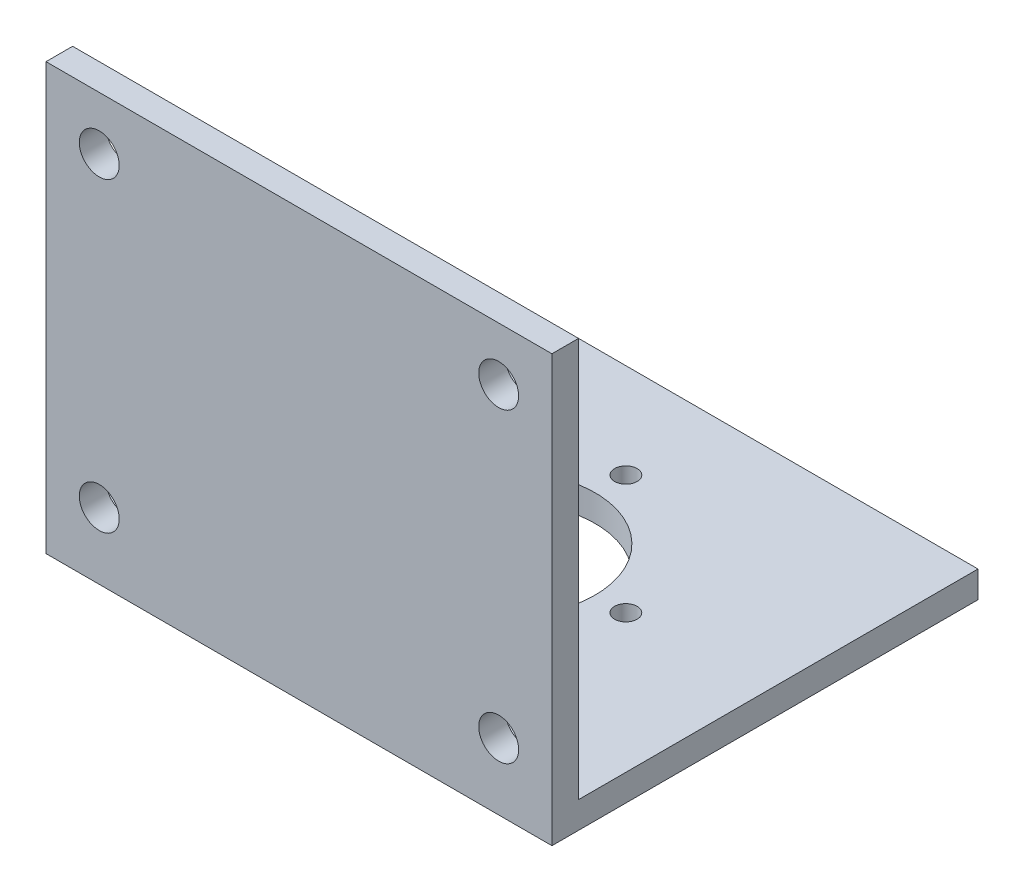
ISO-10303-21;
HEADER;
FILE_DESCRIPTION(('STEP AP214'),'2;1');
FILE_NAME('part.step','',(''),(''),'','','');
FILE_SCHEMA(('AUTOMOTIVE_DESIGN { 1 0 10303 214 1 1 1 1 }'));
ENDSEC;
DATA;
#1=APPLICATION_CONTEXT('core data for automotive mechanical design processes');
#2=APPLICATION_PROTOCOL_DEFINITION('international standard','automotive_design',2000,#1);
#3=PRODUCT_CONTEXT('',#1,'mechanical');
#4=PRODUCT('Part','Part','',(#3));
#5=PRODUCT_RELATED_PRODUCT_CATEGORY('part','',(#4));
#6=PRODUCT_DEFINITION_FORMATION('','',#4);
#7=PRODUCT_DEFINITION_CONTEXT('part definition',#1,'design');
#8=PRODUCT_DEFINITION('design','',#6,#7);
#9=PRODUCT_DEFINITION_SHAPE('','',#8);
#10=(LENGTH_UNIT() NAMED_UNIT(*) SI_UNIT(.MILLI.,.METRE.));
#11=(NAMED_UNIT(*) PLANE_ANGLE_UNIT() SI_UNIT($,.RADIAN.));
#12=(NAMED_UNIT(*) SI_UNIT($,.STERADIAN.) SOLID_ANGLE_UNIT());
#13=UNCERTAINTY_MEASURE_WITH_UNIT(LENGTH_MEASURE(1.E-05),#10,'distance_accuracy_value','');
#14=(GEOMETRIC_REPRESENTATION_CONTEXT(3) GLOBAL_UNCERTAINTY_ASSIGNED_CONTEXT((#13)) GLOBAL_UNIT_ASSIGNED_CONTEXT((#10,
#11,#12)) REPRESENTATION_CONTEXT('',''));
#15=CARTESIAN_POINT('',(0.,0.,0.));
#16=DIRECTION('',(0.,0.,1.));
#17=DIRECTION('',(1.,0.,0.));
#18=AXIS2_PLACEMENT_3D('',#15,#16,#17);
#19=CARTESIAN_POINT('',(0.,0.,0.));
#20=DIRECTION('',(0.,0.,-1.));
#21=DIRECTION('',(-1.,0.,0.));
#22=AXIS2_PLACEMENT_3D('',#19,#20,#21);
#23=PLANE('',#22);
#24=CARTESIAN_POINT('',(3.99999999999998,5.,0.));
#25=DIRECTION('',(0.,0.,-1.));
#26=DIRECTION('',(-1.,0.,0.));
#27=AXIS2_PLACEMENT_3D('',#24,#25,#26);
#28=CIRCLE('',#27,1.5);
#29=CARTESIAN_POINT('',(2.49999999999998,5.,0.));
#30=VERTEX_POINT('',#29);
#31=EDGE_CURVE('E170',#30,#30,#28,.T.);
#32=ORIENTED_EDGE('',*,*,#31,.F.);
#33=EDGE_LOOP('',(#32));
#34=FACE_BOUND('',#33,.T.);
#35=CARTESIAN_POINT('',(34.,5.,0.));
#36=DIRECTION('',(0.,0.,-1.));
#37=DIRECTION('',(-1.,0.,0.));
#38=AXIS2_PLACEMENT_3D('',#35,#36,#37);
#39=CIRCLE('',#38,1.5);
#40=CARTESIAN_POINT('',(32.5,5.,0.));
#41=VERTEX_POINT('',#40);
#42=EDGE_CURVE('E167',#41,#41,#39,.T.);
#43=ORIENTED_EDGE('',*,*,#42,.F.);
#44=EDGE_LOOP('',(#43));
#45=FACE_BOUND('',#44,.T.);
#46=CARTESIAN_POINT('',(33.9999999999999,28.,0.));
#47=DIRECTION('',(0.,0.,-1.));
#48=DIRECTION('',(-1.,0.,0.));
#49=AXIS2_PLACEMENT_3D('',#46,#47,#48);
#50=CIRCLE('',#49,1.5);
#51=CARTESIAN_POINT('',(32.4999999999999,28.,0.));
#52=VERTEX_POINT('',#51);
#53=EDGE_CURVE('E164',#52,#52,#50,.T.);
#54=ORIENTED_EDGE('',*,*,#53,.F.);
#55=EDGE_LOOP('',(#54));
#56=FACE_BOUND('',#55,.T.);
#57=CARTESIAN_POINT('',(3.9999999999999,28.,0.));
#58=DIRECTION('',(0.,0.,-1.));
#59=DIRECTION('',(-1.,0.,0.));
#60=AXIS2_PLACEMENT_3D('',#57,#58,#59);
#61=CIRCLE('',#60,1.5);
#62=CARTESIAN_POINT('',(2.4999999999999,28.,0.));
#63=VERTEX_POINT('',#62);
#64=EDGE_CURVE('E161',#63,#63,#61,.T.);
#65=ORIENTED_EDGE('',*,*,#64,.F.);
#66=EDGE_LOOP('',(#65));
#67=FACE_BOUND('',#66,.T.);
#68=DIRECTION('',(0.,1.,0.));
#69=VECTOR('',#68,1.);
#70=CARTESIAN_POINT('',(38.,0.,0.));
#71=LINE('',#70,#69);
#72=CARTESIAN_POINT('',(38.,2.,0.));
#73=VERTEX_POINT('',#72);
#74=CARTESIAN_POINT('',(38.,32.,0.));
#75=VERTEX_POINT('',#74);
#76=EDGE_CURVE('E99',#73,#75,#71,.T.);
#77=ORIENTED_EDGE('',*,*,#76,.F.);
#78=DIRECTION('',(-1.,0.,0.));
#79=VECTOR('',#78,1.);
#80=CARTESIAN_POINT('',(0.,2.,0.));
#81=LINE('',#80,#79);
#82=CARTESIAN_POINT('',(0.,2.,0.));
#83=VERTEX_POINT('',#82);
#84=EDGE_CURVE('E11',#73,#83,#81,.T.);
#85=ORIENTED_EDGE('',*,*,#84,.T.);
#86=DIRECTION('',(0.,1.,0.));
#87=VECTOR('',#86,1.);
#88=CARTESIAN_POINT('',(0.,0.,0.));
#89=LINE('',#88,#87);
#90=CARTESIAN_POINT('',(0.,32.,0.));
#91=VERTEX_POINT('',#90);
#92=EDGE_CURVE('E65',#83,#91,#89,.T.);
#93=ORIENTED_EDGE('',*,*,#92,.T.);
#94=DIRECTION('',(1.,0.,0.));
#95=VECTOR('',#94,1.);
#96=CARTESIAN_POINT('',(0.,32.,0.));
#97=LINE('',#96,#95);
#98=EDGE_CURVE('E114',#91,#75,#97,.T.);
#99=ORIENTED_EDGE('',*,*,#98,.T.);
#100=EDGE_LOOP('',(#77,#85,#93,#99));
#101=FACE_BOUND('',#100,.T.);
#102=ADVANCED_FACE('F35',(#34,#45,#56,#67,#101),#23,.T.);
#103=CARTESIAN_POINT('',(0.,0.,2.));
#104=DIRECTION('',(-1.,0.,0.));
#105=DIRECTION('',(0.,0.,1.));
#106=AXIS2_PLACEMENT_3D('',#103,#104,#105);
#107=PLANE('',#106);
#108=DIRECTION('',(0.,1.,0.));
#109=VECTOR('',#108,1.);
#110=CARTESIAN_POINT('',(0.,0.,2.));
#111=LINE('',#110,#109);
#112=CARTESIAN_POINT('',(0.,0.,2.));
#113=VERTEX_POINT('',#112);
#114=CARTESIAN_POINT('',(0.,32.,2.));
#115=VERTEX_POINT('',#114);
#116=EDGE_CURVE('E107',#113,#115,#111,.T.);
#117=ORIENTED_EDGE('',*,*,#116,.T.);
#118=DIRECTION('',(0.,0.,-1.));
#119=VECTOR('',#118,1.);
#120=CARTESIAN_POINT('',(0.,32.,2.));
#121=LINE('',#120,#119);
#122=EDGE_CURVE('E103',#115,#91,#121,.T.);
#123=ORIENTED_EDGE('',*,*,#122,.T.);
#124=ORIENTED_EDGE('',*,*,#92,.F.);
#125=DIRECTION('',(0.,0.,1.));
#126=VECTOR('',#125,1.);
#127=CARTESIAN_POINT('',(0.,2.,2.));
#128=LINE('',#127,#126);
#129=CARTESIAN_POINT('',(0.,2.,-30.));
#130=VERTEX_POINT('',#129);
#131=EDGE_CURVE('E174',#130,#83,#128,.T.);
#132=ORIENTED_EDGE('',*,*,#131,.F.);
#133=DIRECTION('',(0.,-1.,0.));
#134=VECTOR('',#133,1.);
#135=CARTESIAN_POINT('',(0.,2.,-30.));
#136=LINE('',#135,#134);
#137=CARTESIAN_POINT('',(0.,0.,-30.));
#138=VERTEX_POINT('',#137);
#139=EDGE_CURVE('E181',#130,#138,#136,.T.);
#140=ORIENTED_EDGE('',*,*,#139,.T.);
#141=DIRECTION('',(0.,0.,-1.));
#142=VECTOR('',#141,1.);
#143=CARTESIAN_POINT('',(0.,0.,2.));
#144=LINE('',#143,#142);
#145=EDGE_CURVE('E45',#113,#138,#144,.T.);
#146=ORIENTED_EDGE('',*,*,#145,.F.);
#147=EDGE_LOOP('',(#117,#123,#124,#132,#140,#146));
#148=FACE_BOUND('',#147,.T.);
#149=ADVANCED_FACE('F37',(#148),#107,.T.);
#150=CARTESIAN_POINT('',(0.,0.,2.));
#151=DIRECTION('',(0.,1.,0.));
#152=DIRECTION('',(0.,0.,1.));
#153=AXIS2_PLACEMENT_3D('',#150,#151,#152);
#154=PLANE('',#153);
#155=CARTESIAN_POINT('',(18.6648437285502,0.,-22.8888437285502));
#156=DIRECTION('',(0.,1.,0.));
#157=DIRECTION('',(0.,0.,1.));
#158=AXIS2_PLACEMENT_3D('',#155,#156,#157);
#159=CIRCLE('',#158,0.8448);
#160=CARTESIAN_POINT('',(18.6648437285502,0.,-22.0440437285502));
#161=VERTEX_POINT('',#160);
#162=EDGE_CURVE('E146',#161,#161,#159,.T.);
#163=ORIENTED_EDGE('',*,*,#162,.T.);
#164=EDGE_LOOP('',(#163));
#165=FACE_BOUND('',#164,.T.);
#166=CARTESIAN_POINT('',(18.6648437285502,0.,-13.9288437285502));
#167=DIRECTION('',(0.,1.,0.));
#168=DIRECTION('',(0.,0.,1.));
#169=AXIS2_PLACEMENT_3D('',#166,#167,#168);
#170=CIRCLE('',#169,6.656);
#171=CARTESIAN_POINT('',(18.6648437285502,0.,-7.27284372855017));
#172=VERTEX_POINT('',#171);
#173=EDGE_CURVE('E134',#172,#172,#170,.T.);
#174=ORIENTED_EDGE('',*,*,#173,.T.);
#175=EDGE_LOOP('',(#174));
#176=FACE_BOUND('',#175,.T.);
#177=CARTESIAN_POINT('',(18.6648437285502,0.,-4.96884372855016));
#178=DIRECTION('',(0.,1.,0.));
#179=DIRECTION('',(0.,0.,1.));
#180=AXIS2_PLACEMENT_3D('',#177,#178,#179);
#181=CIRCLE('',#180,0.844799999999999);
#182=CARTESIAN_POINT('',(18.6648437285502,0.,-4.12404372855016));
#183=VERTEX_POINT('',#182);
#184=EDGE_CURVE('E131',#183,#183,#181,.T.);
#185=ORIENTED_EDGE('',*,*,#184,.T.);
#186=EDGE_LOOP('',(#185));
#187=FACE_BOUND('',#186,.T.);
#188=CARTESIAN_POINT('',(27.6248437285502,0.,-13.9288437285502));
#189=DIRECTION('',(0.,1.,0.));
#190=DIRECTION('',(0.,0.,1.));
#191=AXIS2_PLACEMENT_3D('',#188,#189,#190);
#192=CIRCLE('',#191,0.844799999999999);
#193=CARTESIAN_POINT('',(27.6248437285502,0.,-13.0840437285502));
#194=VERTEX_POINT('',#193);
#195=EDGE_CURVE('E128',#194,#194,#192,.T.);
#196=ORIENTED_EDGE('',*,*,#195,.T.);
#197=EDGE_LOOP('',(#196));
#198=FACE_BOUND('',#197,.T.);
#199=CARTESIAN_POINT('',(9.70484372855018,0.,-13.9288437285502));
#200=DIRECTION('',(0.,1.,0.));
#201=DIRECTION('',(0.,0.,1.));
#202=AXIS2_PLACEMENT_3D('',#199,#200,#201);
#203=CIRCLE('',#202,0.844799999999999);
#204=CARTESIAN_POINT('',(9.70484372855018,0.,-13.0840437285502));
#205=VERTEX_POINT('',#204);
#206=EDGE_CURVE('E124',#205,#205,#203,.T.);
#207=ORIENTED_EDGE('',*,*,#206,.T.);
#208=EDGE_LOOP('',(#207));
#209=FACE_BOUND('',#208,.T.);
#210=ORIENTED_EDGE('',*,*,#145,.T.);
#211=DIRECTION('',(-1.,0.,0.));
#212=VECTOR('',#211,1.);
#213=CARTESIAN_POINT('',(0.,0.,-30.));
#214=LINE('',#213,#212);
#215=CARTESIAN_POINT('',(38.,0.,-30.));
#216=VERTEX_POINT('',#215);
#217=EDGE_CURVE('E173',#216,#138,#214,.T.);
#218=ORIENTED_EDGE('',*,*,#217,.F.);
#219=DIRECTION('',(0.,0.,-1.));
#220=VECTOR('',#219,1.);
#221=CARTESIAN_POINT('',(38.,0.,2.));
#222=LINE('',#221,#220);
#223=CARTESIAN_POINT('',(38.,0.,2.));
#224=VERTEX_POINT('',#223);
#225=EDGE_CURVE('E102',#224,#216,#222,.T.);
#226=ORIENTED_EDGE('',*,*,#225,.F.);
#227=DIRECTION('',(1.,0.,0.));
#228=VECTOR('',#227,1.);
#229=CARTESIAN_POINT('',(0.,0.,2.));
#230=LINE('',#229,#228);
#231=EDGE_CURVE('E90',#113,#224,#230,.T.);
#232=ORIENTED_EDGE('',*,*,#231,.F.);
#233=EDGE_LOOP('',(#210,#218,#226,#232));
#234=FACE_BOUND('',#233,.T.);
#235=ADVANCED_FACE('F196',(#165,#176,#187,#198,#209,#234),#154,.F.);
#236=CARTESIAN_POINT('',(38.,0.,2.));
#237=DIRECTION('',(-1.,0.,0.));
#238=DIRECTION('',(0.,0.,1.));
#239=AXIS2_PLACEMENT_3D('',#236,#237,#238);
#240=PLANE('',#239);
#241=ORIENTED_EDGE('',*,*,#225,.T.);
#242=DIRECTION('',(0.,-1.,0.));
#243=VECTOR('',#242,1.);
#244=CARTESIAN_POINT('',(38.,2.,-30.));
#245=LINE('',#244,#243);
#246=CARTESIAN_POINT('',(38.,2.,-30.));
#247=VERTEX_POINT('',#246);
#248=EDGE_CURVE('E115',#247,#216,#245,.T.);
#249=ORIENTED_EDGE('',*,*,#248,.F.);
#250=DIRECTION('',(0.,0.,-1.));
#251=VECTOR('',#250,1.);
#252=CARTESIAN_POINT('',(38.,2.,2.));
#253=LINE('',#252,#251);
#254=EDGE_CURVE('E176',#73,#247,#253,.T.);
#255=ORIENTED_EDGE('',*,*,#254,.F.);
#256=ORIENTED_EDGE('',*,*,#76,.T.);
#257=DIRECTION('',(0.,0.,-1.));
#258=VECTOR('',#257,1.);
#259=CARTESIAN_POINT('',(38.,32.,2.));
#260=LINE('',#259,#258);
#261=CARTESIAN_POINT('',(38.,32.,2.));
#262=VERTEX_POINT('',#261);
#263=EDGE_CURVE('E96',#262,#75,#260,.T.);
#264=ORIENTED_EDGE('',*,*,#263,.F.);
#265=DIRECTION('',(0.,1.,0.));
#266=VECTOR('',#265,1.);
#267=CARTESIAN_POINT('',(38.,0.,2.));
#268=LINE('',#267,#266);
#269=EDGE_CURVE('E84',#224,#262,#268,.T.);
#270=ORIENTED_EDGE('',*,*,#269,.F.);
#271=EDGE_LOOP('',(#241,#249,#255,#256,#264,#270));
#272=FACE_BOUND('',#271,.T.);
#273=ADVANCED_FACE('F97',(#272),#240,.F.);
#274=CARTESIAN_POINT('',(0.,32.,2.));
#275=DIRECTION('',(0.,1.,0.));
#276=DIRECTION('',(0.,0.,1.));
#277=AXIS2_PLACEMENT_3D('',#274,#275,#276);
#278=PLANE('',#277);
#279=ORIENTED_EDGE('',*,*,#98,.F.);
#280=ORIENTED_EDGE('',*,*,#122,.F.);
#281=DIRECTION('',(1.,0.,0.));
#282=VECTOR('',#281,1.);
#283=CARTESIAN_POINT('',(0.,32.,2.));
#284=LINE('',#283,#282);
#285=EDGE_CURVE('E89',#115,#262,#284,.T.);
#286=ORIENTED_EDGE('',*,*,#285,.T.);
#287=ORIENTED_EDGE('',*,*,#263,.T.);
#288=EDGE_LOOP('',(#279,#280,#286,#287));
#289=FACE_BOUND('',#288,.T.);
#290=ADVANCED_FACE('F106',(#289),#278,.T.);
#291=CARTESIAN_POINT('',(0.,0.,2.));
#292=DIRECTION('',(0.,0.,-1.));
#293=DIRECTION('',(-1.,0.,0.));
#294=AXIS2_PLACEMENT_3D('',#291,#292,#293);
#295=PLANE('',#294);
#296=CARTESIAN_POINT('',(3.99999999999998,5.,2.));
#297=DIRECTION('',(0.,0.,1.));
#298=DIRECTION('',(1.,0.,0.));
#299=AXIS2_PLACEMENT_3D('',#296,#297,#298);
#300=CIRCLE('',#299,1.5);
#301=CARTESIAN_POINT('',(5.49999999999998,5.,2.));
#302=VERTEX_POINT('',#301);
#303=EDGE_CURVE('E149',#302,#302,#300,.T.);
#304=ORIENTED_EDGE('',*,*,#303,.F.);
#305=EDGE_LOOP('',(#304));
#306=FACE_BOUND('',#305,.T.);
#307=CARTESIAN_POINT('',(34.,5.,2.));
#308=DIRECTION('',(0.,0.,1.));
#309=DIRECTION('',(1.,0.,0.));
#310=AXIS2_PLACEMENT_3D('',#307,#308,#309);
#311=CIRCLE('',#310,1.5);
#312=CARTESIAN_POINT('',(35.5,5.,2.));
#313=VERTEX_POINT('',#312);
#314=EDGE_CURVE('E154',#313,#313,#311,.T.);
#315=ORIENTED_EDGE('',*,*,#314,.F.);
#316=EDGE_LOOP('',(#315));
#317=FACE_BOUND('',#316,.T.);
#318=CARTESIAN_POINT('',(33.9999999999999,28.,2.));
#319=DIRECTION('',(0.,0.,1.));
#320=DIRECTION('',(1.,0.,0.));
#321=AXIS2_PLACEMENT_3D('',#318,#319,#320);
#322=CIRCLE('',#321,1.5);
#323=CARTESIAN_POINT('',(35.4999999999999,28.,2.));
#324=VERTEX_POINT('',#323);
#325=EDGE_CURVE('E150',#324,#324,#322,.T.);
#326=ORIENTED_EDGE('',*,*,#325,.F.);
#327=EDGE_LOOP('',(#326));
#328=FACE_BOUND('',#327,.T.);
#329=CARTESIAN_POINT('',(3.9999999999999,28.,2.));
#330=DIRECTION('',(0.,0.,1.));
#331=DIRECTION('',(1.,0.,0.));
#332=AXIS2_PLACEMENT_3D('',#329,#330,#331);
#333=CIRCLE('',#332,1.5);
#334=CARTESIAN_POINT('',(5.4999999999999,28.,2.));
#335=VERTEX_POINT('',#334);
#336=EDGE_CURVE('E153',#335,#335,#333,.T.);
#337=ORIENTED_EDGE('',*,*,#336,.F.);
#338=EDGE_LOOP('',(#337));
#339=FACE_BOUND('',#338,.T.);
#340=ORIENTED_EDGE('',*,*,#269,.T.);
#341=ORIENTED_EDGE('',*,*,#285,.F.);
#342=ORIENTED_EDGE('',*,*,#116,.F.);
#343=ORIENTED_EDGE('',*,*,#231,.T.);
#344=EDGE_LOOP('',(#340,#341,#342,#343));
#345=FACE_BOUND('',#344,.T.);
#346=ADVANCED_FACE('F86',(#306,#317,#328,#339,#345),#295,.F.);
#347=CARTESIAN_POINT('',(0.,2.,-30.));
#348=DIRECTION('',(0.,0.,1.));
#349=DIRECTION('',(1.,0.,0.));
#350=AXIS2_PLACEMENT_3D('',#347,#348,#349);
#351=PLANE('',#350);
#352=ORIENTED_EDGE('',*,*,#217,.T.);
#353=ORIENTED_EDGE('',*,*,#139,.F.);
#354=DIRECTION('',(-1.,0.,0.));
#355=VECTOR('',#354,1.);
#356=CARTESIAN_POINT('',(0.,2.,-30.));
#357=LINE('',#356,#355);
#358=EDGE_CURVE('E178',#247,#130,#357,.T.);
#359=ORIENTED_EDGE('',*,*,#358,.F.);
#360=ORIENTED_EDGE('',*,*,#248,.T.);
#361=EDGE_LOOP('',(#352,#353,#359,#360));
#362=FACE_BOUND('',#361,.T.);
#363=ADVANCED_FACE('F190',(#362),#351,.F.);
#364=CARTESIAN_POINT('',(0.,2.,0.));
#365=DIRECTION('',(0.,-1.,0.));
#366=DIRECTION('',(0.,0.,-1.));
#367=AXIS2_PLACEMENT_3D('',#364,#365,#366);
#368=PLANE('',#367);
#369=CARTESIAN_POINT('',(18.6648437285502,2.,-22.8888437285502));
#370=DIRECTION('',(0.,-1.,0.));
#371=DIRECTION('',(0.,0.,-1.));
#372=AXIS2_PLACEMENT_3D('',#369,#370,#371);
#373=CIRCLE('',#372,0.8448);
#374=CARTESIAN_POINT('',(18.6648437285502,2.,-22.0440437285502));
#375=VERTEX_POINT('',#374);
#376=EDGE_CURVE('E39',#375,#375,#373,.T.);
#377=ORIENTED_EDGE('',*,*,#376,.T.);
#378=EDGE_LOOP('',(#377));
#379=FACE_BOUND('',#378,.T.);
#380=CARTESIAN_POINT('',(18.6648437285502,2.,-13.9288437285502));
#381=DIRECTION('',(0.,-1.,0.));
#382=DIRECTION('',(0.,0.,-1.));
#383=AXIS2_PLACEMENT_3D('',#380,#381,#382);
#384=CIRCLE('',#383,6.656);
#385=CARTESIAN_POINT('',(18.6648437285502,2.,-7.27284372855017));
#386=VERTEX_POINT('',#385);
#387=EDGE_CURVE('E132',#386,#386,#384,.T.);
#388=ORIENTED_EDGE('',*,*,#387,.T.);
#389=EDGE_LOOP('',(#388));
#390=FACE_BOUND('',#389,.T.);
#391=CARTESIAN_POINT('',(18.6648437285502,2.,-4.96884372855016));
#392=DIRECTION('',(0.,-1.,0.));
#393=DIRECTION('',(0.,0.,-1.));
#394=AXIS2_PLACEMENT_3D('',#391,#392,#393);
#395=CIRCLE('',#394,0.844799999999999);
#396=CARTESIAN_POINT('',(18.6648437285502,2.,-4.12404372855016));
#397=VERTEX_POINT('',#396);
#398=EDGE_CURVE('E129',#397,#397,#395,.T.);
#399=ORIENTED_EDGE('',*,*,#398,.T.);
#400=EDGE_LOOP('',(#399));
#401=FACE_BOUND('',#400,.T.);
#402=CARTESIAN_POINT('',(27.6248437285502,2.,-13.9288437285502));
#403=DIRECTION('',(0.,-1.,0.));
#404=DIRECTION('',(0.,0.,-1.));
#405=AXIS2_PLACEMENT_3D('',#402,#403,#404);
#406=CIRCLE('',#405,0.844799999999999);
#407=CARTESIAN_POINT('',(27.6248437285502,2.,-13.0840437285502));
#408=VERTEX_POINT('',#407);
#409=EDGE_CURVE('E125',#408,#408,#406,.T.);
#410=ORIENTED_EDGE('',*,*,#409,.T.);
#411=EDGE_LOOP('',(#410));
#412=FACE_BOUND('',#411,.T.);
#413=CARTESIAN_POINT('',(9.70484372855018,2.,-13.9288437285502));
#414=DIRECTION('',(0.,-1.,0.));
#415=DIRECTION('',(0.,0.,-1.));
#416=AXIS2_PLACEMENT_3D('',#413,#414,#415);
#417=CIRCLE('',#416,0.844799999999999);
#418=CARTESIAN_POINT('',(9.70484372855018,2.,-13.0840437285502));
#419=VERTEX_POINT('',#418);
#420=EDGE_CURVE('E121',#419,#419,#417,.T.);
#421=ORIENTED_EDGE('',*,*,#420,.T.);
#422=EDGE_LOOP('',(#421));
#423=FACE_BOUND('',#422,.T.);
#424=ORIENTED_EDGE('',*,*,#84,.F.);
#425=ORIENTED_EDGE('',*,*,#254,.T.);
#426=ORIENTED_EDGE('',*,*,#358,.T.);
#427=ORIENTED_EDGE('',*,*,#131,.T.);
#428=EDGE_LOOP('',(#424,#425,#426,#427));
#429=FACE_BOUND('',#428,.T.);
#430=ADVANCED_FACE('F199',(#379,#390,#401,#412,#423,#429),#368,.F.);
#431=CARTESIAN_POINT('',(3.9999999999999,28.,-30.));
#432=DIRECTION('',(0.,0.,1.));
#433=DIRECTION('',(1.,0.,0.));
#434=AXIS2_PLACEMENT_3D('',#431,#432,#433);
#435=CYLINDRICAL_SURFACE('',#434,1.5);
#436=ORIENTED_EDGE('',*,*,#64,.T.);
#437=EDGE_LOOP('',(#436));
#438=FACE_BOUND('',#437,.T.);
#439=ORIENTED_EDGE('',*,*,#336,.T.);
#440=EDGE_LOOP('',(#439));
#441=FACE_BOUND('',#440,.T.);
#442=ADVANCED_FACE('F232',(#438,#441),#435,.F.);
#443=CARTESIAN_POINT('',(33.9999999999999,28.,-30.));
#444=DIRECTION('',(0.,0.,1.));
#445=DIRECTION('',(1.,0.,0.));
#446=AXIS2_PLACEMENT_3D('',#443,#444,#445);
#447=CYLINDRICAL_SURFACE('',#446,1.5);
#448=ORIENTED_EDGE('',*,*,#53,.T.);
#449=EDGE_LOOP('',(#448));
#450=FACE_BOUND('',#449,.T.);
#451=ORIENTED_EDGE('',*,*,#325,.T.);
#452=EDGE_LOOP('',(#451));
#453=FACE_BOUND('',#452,.T.);
#454=ADVANCED_FACE('F234',(#450,#453),#447,.F.);
#455=CARTESIAN_POINT('',(34.,5.,-30.));
#456=DIRECTION('',(0.,0.,1.));
#457=DIRECTION('',(1.,0.,0.));
#458=AXIS2_PLACEMENT_3D('',#455,#456,#457);
#459=CYLINDRICAL_SURFACE('',#458,1.5);
#460=ORIENTED_EDGE('',*,*,#42,.T.);
#461=EDGE_LOOP('',(#460));
#462=FACE_BOUND('',#461,.T.);
#463=ORIENTED_EDGE('',*,*,#314,.T.);
#464=EDGE_LOOP('',(#463));
#465=FACE_BOUND('',#464,.T.);
#466=ADVANCED_FACE('F241',(#462,#465),#459,.F.);
#467=CARTESIAN_POINT('',(3.99999999999998,5.,-30.));
#468=DIRECTION('',(0.,0.,1.));
#469=DIRECTION('',(1.,0.,0.));
#470=AXIS2_PLACEMENT_3D('',#467,#468,#469);
#471=CYLINDRICAL_SURFACE('',#470,1.5);
#472=ORIENTED_EDGE('',*,*,#31,.T.);
#473=EDGE_LOOP('',(#472));
#474=FACE_BOUND('',#473,.T.);
#475=ORIENTED_EDGE('',*,*,#303,.T.);
#476=EDGE_LOOP('',(#475));
#477=FACE_BOUND('',#476,.T.);
#478=ADVANCED_FACE('F247',(#474,#477),#471,.F.);
#479=CARTESIAN_POINT('',(9.70484372855018,-1.2E-05,-13.9288437285502));
#480=DIRECTION('',(0.,1.,0.));
#481=DIRECTION('',(0.,0.,1.));
#482=AXIS2_PLACEMENT_3D('',#479,#480,#481);
#483=CYLINDRICAL_SURFACE('',#482,0.844799999999999);
#484=CARTESIAN_POINT('',(9.70484372855018,2.,-13.0840437285502));
#485=CARTESIAN_POINT('',(9.70484372855018,1.97916666666667,-13.0840437285502));
#486=CARTESIAN_POINT('',(9.70484372855018,1.95833333333333,-13.0840437285502));
#487=CARTESIAN_POINT('',(9.70484372855018,1.91666666666667,-13.0840437285502));
#488=CARTESIAN_POINT('',(9.70484372855018,1.89583333333333,-13.0840437285502));
#489=CARTESIAN_POINT('',(9.70484372855018,1.85416666666667,-13.0840437285502));
#490=CARTESIAN_POINT('',(9.70484372855018,1.83333333333333,-13.0840437285502));
#491=CARTESIAN_POINT('',(9.70484372855018,1.79166666666667,-13.0840437285502));
#492=CARTESIAN_POINT('',(9.70484372855018,1.77083333333333,-13.0840437285502));
#493=CARTESIAN_POINT('',(9.70484372855018,1.72916666666667,-13.0840437285502));
#494=CARTESIAN_POINT('',(9.70484372855018,1.70833333333333,-13.0840437285502));
#495=CARTESIAN_POINT('',(9.70484372855018,1.66666666666667,-13.0840437285502));
#496=CARTESIAN_POINT('',(9.70484372855018,1.64583333333333,-13.0840437285502));
#497=CARTESIAN_POINT('',(9.70484372855018,1.60416666666667,-13.0840437285502));
#498=CARTESIAN_POINT('',(9.70484372855018,1.58333333333333,-13.0840437285502));
#499=CARTESIAN_POINT('',(9.70484372855018,1.54166666666667,-13.0840437285502));
#500=CARTESIAN_POINT('',(9.70484372855018,1.52083333333333,-13.0840437285502));
#501=CARTESIAN_POINT('',(9.70484372855018,1.47916666666667,-13.0840437285502));
#502=CARTESIAN_POINT('',(9.70484372855018,1.45833333333333,-13.0840437285502));
#503=CARTESIAN_POINT('',(9.70484372855018,1.41666666666667,-13.0840437285502));
#504=CARTESIAN_POINT('',(9.70484372855018,1.39583333333333,-13.0840437285502));
#505=CARTESIAN_POINT('',(9.70484372855018,1.35416666666667,-13.0840437285502));
#506=CARTESIAN_POINT('',(9.70484372855018,1.33333333333333,-13.0840437285502));
#507=CARTESIAN_POINT('',(9.70484372855018,1.29166666666667,-13.0840437285502));
#508=CARTESIAN_POINT('',(9.70484372855018,1.27083333333333,-13.0840437285502));
#509=CARTESIAN_POINT('',(9.70484372855018,1.22916666666667,-13.0840437285502));
#510=CARTESIAN_POINT('',(9.70484372855018,1.20833333333333,-13.0840437285502));
#511=CARTESIAN_POINT('',(9.70484372855018,1.16666666666667,-13.0840437285502));
#512=CARTESIAN_POINT('',(9.70484372855018,1.14583333333333,-13.0840437285502));
#513=CARTESIAN_POINT('',(9.70484372855018,1.10416666666667,-13.0840437285502));
#514=CARTESIAN_POINT('',(9.70484372855018,1.08333333333333,-13.0840437285502));
#515=CARTESIAN_POINT('',(9.70484372855018,1.04166666666667,-13.0840437285502));
#516=CARTESIAN_POINT('',(9.70484372855018,1.02083333333333,-13.0840437285502));
#517=CARTESIAN_POINT('',(9.70484372855018,0.979166666666667,-13.0840437285502));
#518=CARTESIAN_POINT('',(9.70484372855018,0.958333333333334,-13.0840437285502));
#519=CARTESIAN_POINT('',(9.70484372855018,0.916666666666667,-13.0840437285502));
#520=CARTESIAN_POINT('',(9.70484372855018,0.895833333333334,-13.0840437285502));
#521=CARTESIAN_POINT('',(9.70484372855018,0.854166666666667,-13.0840437285502));
#522=CARTESIAN_POINT('',(9.70484372855018,0.833333333333334,-13.0840437285502));
#523=CARTESIAN_POINT('',(9.70484372855018,0.791666666666667,-13.0840437285502));
#524=CARTESIAN_POINT('',(9.70484372855018,0.770833333333334,-13.0840437285502));
#525=CARTESIAN_POINT('',(9.70484372855018,0.729166666666667,-13.0840437285502));
#526=CARTESIAN_POINT('',(9.70484372855018,0.708333333333334,-13.0840437285502));
#527=CARTESIAN_POINT('',(9.70484372855018,0.666666666666667,-13.0840437285502));
#528=CARTESIAN_POINT('',(9.70484372855018,0.645833333333334,-13.0840437285502));
#529=CARTESIAN_POINT('',(9.70484372855018,0.604166666666667,-13.0840437285502));
#530=CARTESIAN_POINT('',(9.70484372855018,0.583333333333333,-13.0840437285502));
#531=CARTESIAN_POINT('',(9.70484372855018,0.541666666666667,-13.0840437285502));
#532=CARTESIAN_POINT('',(9.70484372855018,0.520833333333333,-13.0840437285502));
#533=CARTESIAN_POINT('',(9.70484372855018,0.479166666666667,-13.0840437285502));
#534=CARTESIAN_POINT('',(9.70484372855018,0.458333333333334,-13.0840437285502));
#535=CARTESIAN_POINT('',(9.70484372855018,0.416666666666667,-13.0840437285502));
#536=CARTESIAN_POINT('',(9.70484372855018,0.395833333333334,-13.0840437285502));
#537=CARTESIAN_POINT('',(9.70484372855018,0.354166666666667,-13.0840437285502));
#538=CARTESIAN_POINT('',(9.70484372855018,0.333333333333334,-13.0840437285502));
#539=CARTESIAN_POINT('',(9.70484372855018,0.291666666666667,-13.0840437285502));
#540=CARTESIAN_POINT('',(9.70484372855018,0.270833333333333,-13.0840437285502));
#541=CARTESIAN_POINT('',(9.70484372855018,0.229166666666667,-13.0840437285502));
#542=CARTESIAN_POINT('',(9.70484372855018,0.208333333333333,-13.0840437285502));
#543=CARTESIAN_POINT('',(9.70484372855018,0.166666666666667,-13.0840437285502));
#544=CARTESIAN_POINT('',(9.70484372855018,0.145833333333334,-13.0840437285502));
#545=CARTESIAN_POINT('',(9.70484372855018,0.104166666666667,-13.0840437285502));
#546=CARTESIAN_POINT('',(9.70484372855018,0.0833333333333336,-13.0840437285502));
#547=CARTESIAN_POINT('',(9.70484372855018,0.0416666666666669,-13.0840437285502));
#548=CARTESIAN_POINT('',(9.70484372855018,0.0208333333333335,-13.0840437285502));
#549=CARTESIAN_POINT('',(9.70484372855018,0.,-13.0840437285502));
#550=B_SPLINE_CURVE_WITH_KNOTS('',3,(#484,#485,#486,#487,#488,#489,#490,#491,#492,#493,#494,
#495,#496,#497,#498,#499,#500,#501,#502,#503,#504,#505,#506,#507,#508,#509,#510,#511,#512,#513,
#514,#515,#516,#517,#518,#519,#520,#521,#522,#523,#524,#525,#526,#527,#528,#529,#530,#531,#532,
#533,#534,#535,#536,#537,#538,#539,#540,#541,#542,#543,#544,#545,#546,#547,#548,#549),
.UNSPECIFIED.,.F.,.F.,(4,2,2,2,2,2,2,2,2,2,2,2,2,2,2,2,2,2,2,2,2,2,2,2,2,2,2,2,2,2,2,2,4),(0.,
0.0624999999999996,0.125,0.1875,0.25,0.3125,0.375,0.4375,0.5,0.5625,0.625,0.6875,0.75,0.8125,
0.875,0.9375,1.,1.0625,1.125,1.1875,1.25,1.3125,1.375,1.4375,1.5,1.5625,1.625,1.6875,1.75,
1.8125,1.875,1.9375,2.),.UNSPECIFIED.);
#551=EDGE_CURVE('BSEAM250',#419,#205,#550,.T.);
#552=ORIENTED_EDGE('',*,*,#420,.F.);
#553=ORIENTED_EDGE('',*,*,#206,.F.);
#554=ORIENTED_EDGE('',*,*,#551,.T.);
#555=ORIENTED_EDGE('',*,*,#551,.F.);
#556=EDGE_LOOP('',(#552,#554,#553,#555));
#557=FACE_BOUND('',#556,.T.);
#558=ADVANCED_FACE('F250',(#557),#483,.F.);
#559=CARTESIAN_POINT('',(27.6248437285502,-1.2E-05,-13.9288437285502));
#560=DIRECTION('',(0.,1.,0.));
#561=DIRECTION('',(0.,0.,1.));
#562=AXIS2_PLACEMENT_3D('',#559,#560,#561);
#563=CYLINDRICAL_SURFACE('',#562,0.844799999999999);
#564=CARTESIAN_POINT('',(27.6248437285502,2.,-13.0840437285502));
#565=CARTESIAN_POINT('',(27.6248437285502,1.97916666666667,-13.0840437285502));
#566=CARTESIAN_POINT('',(27.6248437285502,1.95833333333333,-13.0840437285502));
#567=CARTESIAN_POINT('',(27.6248437285502,1.91666666666667,-13.0840437285502));
#568=CARTESIAN_POINT('',(27.6248437285502,1.89583333333333,-13.0840437285502));
#569=CARTESIAN_POINT('',(27.6248437285502,1.85416666666667,-13.0840437285502));
#570=CARTESIAN_POINT('',(27.6248437285502,1.83333333333333,-13.0840437285502));
#571=CARTESIAN_POINT('',(27.6248437285502,1.79166666666667,-13.0840437285502));
#572=CARTESIAN_POINT('',(27.6248437285502,1.77083333333333,-13.0840437285502));
#573=CARTESIAN_POINT('',(27.6248437285502,1.72916666666667,-13.0840437285502));
#574=CARTESIAN_POINT('',(27.6248437285502,1.70833333333333,-13.0840437285502));
#575=CARTESIAN_POINT('',(27.6248437285502,1.66666666666667,-13.0840437285502));
#576=CARTESIAN_POINT('',(27.6248437285502,1.64583333333333,-13.0840437285502));
#577=CARTESIAN_POINT('',(27.6248437285502,1.60416666666667,-13.0840437285502));
#578=CARTESIAN_POINT('',(27.6248437285502,1.58333333333333,-13.0840437285502));
#579=CARTESIAN_POINT('',(27.6248437285502,1.54166666666667,-13.0840437285502));
#580=CARTESIAN_POINT('',(27.6248437285502,1.52083333333333,-13.0840437285502));
#581=CARTESIAN_POINT('',(27.6248437285502,1.47916666666667,-13.0840437285502));
#582=CARTESIAN_POINT('',(27.6248437285502,1.45833333333333,-13.0840437285502));
#583=CARTESIAN_POINT('',(27.6248437285502,1.41666666666667,-13.0840437285502));
#584=CARTESIAN_POINT('',(27.6248437285502,1.39583333333333,-13.0840437285502));
#585=CARTESIAN_POINT('',(27.6248437285502,1.35416666666667,-13.0840437285502));
#586=CARTESIAN_POINT('',(27.6248437285502,1.33333333333333,-13.0840437285502));
#587=CARTESIAN_POINT('',(27.6248437285502,1.29166666666667,-13.0840437285502));
#588=CARTESIAN_POINT('',(27.6248437285502,1.27083333333333,-13.0840437285502));
#589=CARTESIAN_POINT('',(27.6248437285502,1.22916666666667,-13.0840437285502));
#590=CARTESIAN_POINT('',(27.6248437285502,1.20833333333333,-13.0840437285502));
#591=CARTESIAN_POINT('',(27.6248437285502,1.16666666666667,-13.0840437285502));
#592=CARTESIAN_POINT('',(27.6248437285502,1.14583333333333,-13.0840437285502));
#593=CARTESIAN_POINT('',(27.6248437285502,1.10416666666667,-13.0840437285502));
#594=CARTESIAN_POINT('',(27.6248437285502,1.08333333333333,-13.0840437285502));
#595=CARTESIAN_POINT('',(27.6248437285502,1.04166666666667,-13.0840437285502));
#596=CARTESIAN_POINT('',(27.6248437285502,1.02083333333333,-13.0840437285502));
#597=CARTESIAN_POINT('',(27.6248437285502,0.979166666666667,-13.0840437285502));
#598=CARTESIAN_POINT('',(27.6248437285502,0.958333333333334,-13.0840437285502));
#599=CARTESIAN_POINT('',(27.6248437285502,0.916666666666667,-13.0840437285502));
#600=CARTESIAN_POINT('',(27.6248437285502,0.895833333333334,-13.0840437285502));
#601=CARTESIAN_POINT('',(27.6248437285502,0.854166666666667,-13.0840437285502));
#602=CARTESIAN_POINT('',(27.6248437285502,0.833333333333334,-13.0840437285502));
#603=CARTESIAN_POINT('',(27.6248437285502,0.791666666666667,-13.0840437285502));
#604=CARTESIAN_POINT('',(27.6248437285502,0.770833333333334,-13.0840437285502));
#605=CARTESIAN_POINT('',(27.6248437285502,0.729166666666667,-13.0840437285502));
#606=CARTESIAN_POINT('',(27.6248437285502,0.708333333333334,-13.0840437285502));
#607=CARTESIAN_POINT('',(27.6248437285502,0.666666666666667,-13.0840437285502));
#608=CARTESIAN_POINT('',(27.6248437285502,0.645833333333334,-13.0840437285502));
#609=CARTESIAN_POINT('',(27.6248437285502,0.604166666666667,-13.0840437285502));
#610=CARTESIAN_POINT('',(27.6248437285502,0.583333333333333,-13.0840437285502));
#611=CARTESIAN_POINT('',(27.6248437285502,0.541666666666667,-13.0840437285502));
#612=CARTESIAN_POINT('',(27.6248437285502,0.520833333333333,-13.0840437285502));
#613=CARTESIAN_POINT('',(27.6248437285502,0.479166666666667,-13.0840437285502));
#614=CARTESIAN_POINT('',(27.6248437285502,0.458333333333334,-13.0840437285502));
#615=CARTESIAN_POINT('',(27.6248437285502,0.416666666666667,-13.0840437285502));
#616=CARTESIAN_POINT('',(27.6248437285502,0.395833333333334,-13.0840437285502));
#617=CARTESIAN_POINT('',(27.6248437285502,0.354166666666667,-13.0840437285502));
#618=CARTESIAN_POINT('',(27.6248437285502,0.333333333333334,-13.0840437285502));
#619=CARTESIAN_POINT('',(27.6248437285502,0.291666666666667,-13.0840437285502));
#620=CARTESIAN_POINT('',(27.6248437285502,0.270833333333333,-13.0840437285502));
#621=CARTESIAN_POINT('',(27.6248437285502,0.229166666666667,-13.0840437285502));
#622=CARTESIAN_POINT('',(27.6248437285502,0.208333333333333,-13.0840437285502));
#623=CARTESIAN_POINT('',(27.6248437285502,0.166666666666667,-13.0840437285502));
#624=CARTESIAN_POINT('',(27.6248437285502,0.145833333333334,-13.0840437285502));
#625=CARTESIAN_POINT('',(27.6248437285502,0.104166666666667,-13.0840437285502));
#626=CARTESIAN_POINT('',(27.6248437285502,0.0833333333333336,-13.0840437285502));
#627=CARTESIAN_POINT('',(27.6248437285502,0.0416666666666669,-13.0840437285502));
#628=CARTESIAN_POINT('',(27.6248437285502,0.0208333333333335,-13.0840437285502));
#629=CARTESIAN_POINT('',(27.6248437285502,0.,-13.0840437285502));
#630=B_SPLINE_CURVE_WITH_KNOTS('',3,(#564,#565,#566,#567,#568,#569,#570,#571,#572,#573,#574,
#575,#576,#577,#578,#579,#580,#581,#582,#583,#584,#585,#586,#587,#588,#589,#590,#591,#592,#593,
#594,#595,#596,#597,#598,#599,#600,#601,#602,#603,#604,#605,#606,#607,#608,#609,#610,#611,#612,
#613,#614,#615,#616,#617,#618,#619,#620,#621,#622,#623,#624,#625,#626,#627,#628,#629),
.UNSPECIFIED.,.F.,.F.,(4,2,2,2,2,2,2,2,2,2,2,2,2,2,2,2,2,2,2,2,2,2,2,2,2,2,2,2,2,2,2,2,4),(0.,
0.0624999999999996,0.125,0.1875,0.25,0.3125,0.375,0.4375,0.5,0.5625,0.625,0.6875,0.75,0.8125,
0.875,0.9375,1.,1.0625,1.125,1.1875,1.25,1.3125,1.375,1.4375,1.5,1.5625,1.625,1.6875,1.75,
1.8125,1.875,1.9375,2.),.UNSPECIFIED.);
#631=EDGE_CURVE('BSEAM255',#408,#194,#630,.T.);
#632=ORIENTED_EDGE('',*,*,#409,.F.);
#633=ORIENTED_EDGE('',*,*,#195,.F.);
#634=ORIENTED_EDGE('',*,*,#631,.T.);
#635=ORIENTED_EDGE('',*,*,#631,.F.);
#636=EDGE_LOOP('',(#632,#634,#633,#635));
#637=FACE_BOUND('',#636,.T.);
#638=ADVANCED_FACE('F255',(#637),#563,.F.);
#639=CARTESIAN_POINT('',(18.6648437285502,-1.2E-05,-4.96884372855016));
#640=DIRECTION('',(0.,1.,0.));
#641=DIRECTION('',(0.,0.,1.));
#642=AXIS2_PLACEMENT_3D('',#639,#640,#641);
#643=CYLINDRICAL_SURFACE('',#642,0.844799999999999);
#644=CARTESIAN_POINT('',(18.6648437285502,2.,-4.12404372855016));
#645=CARTESIAN_POINT('',(18.6648437285502,1.97916666666667,-4.12404372855016));
#646=CARTESIAN_POINT('',(18.6648437285502,1.95833333333333,-4.12404372855016));
#647=CARTESIAN_POINT('',(18.6648437285502,1.91666666666667,-4.12404372855016));
#648=CARTESIAN_POINT('',(18.6648437285502,1.89583333333333,-4.12404372855016));
#649=CARTESIAN_POINT('',(18.6648437285502,1.85416666666667,-4.12404372855016));
#650=CARTESIAN_POINT('',(18.6648437285502,1.83333333333333,-4.12404372855016));
#651=CARTESIAN_POINT('',(18.6648437285502,1.79166666666667,-4.12404372855016));
#652=CARTESIAN_POINT('',(18.6648437285502,1.77083333333333,-4.12404372855016));
#653=CARTESIAN_POINT('',(18.6648437285502,1.72916666666667,-4.12404372855016));
#654=CARTESIAN_POINT('',(18.6648437285502,1.70833333333333,-4.12404372855016));
#655=CARTESIAN_POINT('',(18.6648437285502,1.66666666666667,-4.12404372855016));
#656=CARTESIAN_POINT('',(18.6648437285502,1.64583333333333,-4.12404372855016));
#657=CARTESIAN_POINT('',(18.6648437285502,1.60416666666667,-4.12404372855016));
#658=CARTESIAN_POINT('',(18.6648437285502,1.58333333333333,-4.12404372855016));
#659=CARTESIAN_POINT('',(18.6648437285502,1.54166666666667,-4.12404372855016));
#660=CARTESIAN_POINT('',(18.6648437285502,1.52083333333333,-4.12404372855016));
#661=CARTESIAN_POINT('',(18.6648437285502,1.47916666666667,-4.12404372855016));
#662=CARTESIAN_POINT('',(18.6648437285502,1.45833333333333,-4.12404372855016));
#663=CARTESIAN_POINT('',(18.6648437285502,1.41666666666667,-4.12404372855016));
#664=CARTESIAN_POINT('',(18.6648437285502,1.39583333333333,-4.12404372855016));
#665=CARTESIAN_POINT('',(18.6648437285502,1.35416666666667,-4.12404372855016));
#666=CARTESIAN_POINT('',(18.6648437285502,1.33333333333333,-4.12404372855016));
#667=CARTESIAN_POINT('',(18.6648437285502,1.29166666666667,-4.12404372855016));
#668=CARTESIAN_POINT('',(18.6648437285502,1.27083333333333,-4.12404372855016));
#669=CARTESIAN_POINT('',(18.6648437285502,1.22916666666667,-4.12404372855016));
#670=CARTESIAN_POINT('',(18.6648437285502,1.20833333333333,-4.12404372855016));
#671=CARTESIAN_POINT('',(18.6648437285502,1.16666666666667,-4.12404372855016));
#672=CARTESIAN_POINT('',(18.6648437285502,1.14583333333333,-4.12404372855016));
#673=CARTESIAN_POINT('',(18.6648437285502,1.10416666666667,-4.12404372855016));
#674=CARTESIAN_POINT('',(18.6648437285502,1.08333333333333,-4.12404372855016));
#675=CARTESIAN_POINT('',(18.6648437285502,1.04166666666667,-4.12404372855016));
#676=CARTESIAN_POINT('',(18.6648437285502,1.02083333333333,-4.12404372855016));
#677=CARTESIAN_POINT('',(18.6648437285502,0.979166666666667,-4.12404372855016));
#678=CARTESIAN_POINT('',(18.6648437285502,0.958333333333334,-4.12404372855016));
#679=CARTESIAN_POINT('',(18.6648437285502,0.916666666666667,-4.12404372855016));
#680=CARTESIAN_POINT('',(18.6648437285502,0.895833333333334,-4.12404372855016));
#681=CARTESIAN_POINT('',(18.6648437285502,0.854166666666667,-4.12404372855016));
#682=CARTESIAN_POINT('',(18.6648437285502,0.833333333333334,-4.12404372855016));
#683=CARTESIAN_POINT('',(18.6648437285502,0.791666666666667,-4.12404372855016));
#684=CARTESIAN_POINT('',(18.6648437285502,0.770833333333334,-4.12404372855016));
#685=CARTESIAN_POINT('',(18.6648437285502,0.729166666666667,-4.12404372855016));
#686=CARTESIAN_POINT('',(18.6648437285502,0.708333333333334,-4.12404372855016));
#687=CARTESIAN_POINT('',(18.6648437285502,0.666666666666667,-4.12404372855016));
#688=CARTESIAN_POINT('',(18.6648437285502,0.645833333333334,-4.12404372855016));
#689=CARTESIAN_POINT('',(18.6648437285502,0.604166666666667,-4.12404372855016));
#690=CARTESIAN_POINT('',(18.6648437285502,0.583333333333333,-4.12404372855016));
#691=CARTESIAN_POINT('',(18.6648437285502,0.541666666666667,-4.12404372855016));
#692=CARTESIAN_POINT('',(18.6648437285502,0.520833333333333,-4.12404372855016));
#693=CARTESIAN_POINT('',(18.6648437285502,0.479166666666667,-4.12404372855016));
#694=CARTESIAN_POINT('',(18.6648437285502,0.458333333333334,-4.12404372855016));
#695=CARTESIAN_POINT('',(18.6648437285502,0.416666666666667,-4.12404372855016));
#696=CARTESIAN_POINT('',(18.6648437285502,0.395833333333334,-4.12404372855016));
#697=CARTESIAN_POINT('',(18.6648437285502,0.354166666666667,-4.12404372855016));
#698=CARTESIAN_POINT('',(18.6648437285502,0.333333333333334,-4.12404372855016));
#699=CARTESIAN_POINT('',(18.6648437285502,0.291666666666667,-4.12404372855016));
#700=CARTESIAN_POINT('',(18.6648437285502,0.270833333333333,-4.12404372855016));
#701=CARTESIAN_POINT('',(18.6648437285502,0.229166666666667,-4.12404372855016));
#702=CARTESIAN_POINT('',(18.6648437285502,0.208333333333333,-4.12404372855016));
#703=CARTESIAN_POINT('',(18.6648437285502,0.166666666666667,-4.12404372855016));
#704=CARTESIAN_POINT('',(18.6648437285502,0.145833333333334,-4.12404372855016));
#705=CARTESIAN_POINT('',(18.6648437285502,0.104166666666667,-4.12404372855016));
#706=CARTESIAN_POINT('',(18.6648437285502,0.0833333333333336,-4.12404372855016));
#707=CARTESIAN_POINT('',(18.6648437285502,0.0416666666666669,-4.12404372855016));
#708=CARTESIAN_POINT('',(18.6648437285502,0.0208333333333335,-4.12404372855016));
#709=CARTESIAN_POINT('',(18.6648437285502,0.,-4.12404372855016));
#710=B_SPLINE_CURVE_WITH_KNOTS('',3,(#644,#645,#646,#647,#648,#649,#650,#651,#652,#653,#654,
#655,#656,#657,#658,#659,#660,#661,#662,#663,#664,#665,#666,#667,#668,#669,#670,#671,#672,#673,
#674,#675,#676,#677,#678,#679,#680,#681,#682,#683,#684,#685,#686,#687,#688,#689,#690,#691,#692,
#693,#694,#695,#696,#697,#698,#699,#700,#701,#702,#703,#704,#705,#706,#707,#708,#709),
.UNSPECIFIED.,.F.,.F.,(4,2,2,2,2,2,2,2,2,2,2,2,2,2,2,2,2,2,2,2,2,2,2,2,2,2,2,2,2,2,2,2,4),(0.,
0.0624999999999996,0.125,0.1875,0.25,0.3125,0.375,0.4375,0.5,0.5625,0.625,0.6875,0.75,0.8125,
0.875,0.9375,1.,1.0625,1.125,1.1875,1.25,1.3125,1.375,1.4375,1.5,1.5625,1.625,1.6875,1.75,
1.8125,1.875,1.9375,2.),.UNSPECIFIED.);
#711=EDGE_CURVE('BSEAM258',#397,#183,#710,.T.);
#712=ORIENTED_EDGE('',*,*,#398,.F.);
#713=ORIENTED_EDGE('',*,*,#184,.F.);
#714=ORIENTED_EDGE('',*,*,#711,.T.);
#715=ORIENTED_EDGE('',*,*,#711,.F.);
#716=EDGE_LOOP('',(#712,#714,#713,#715));
#717=FACE_BOUND('',#716,.T.);
#718=ADVANCED_FACE('F258',(#717),#643,.F.);
#719=CARTESIAN_POINT('',(18.6648437285502,-1.2E-05,-13.9288437285502));
#720=DIRECTION('',(0.,1.,0.));
#721=DIRECTION('',(0.,0.,1.));
#722=AXIS2_PLACEMENT_3D('',#719,#720,#721);
#723=CYLINDRICAL_SURFACE('',#722,6.656);
#724=CARTESIAN_POINT('',(18.6648437285502,2.,-7.27284372855017));
#725=CARTESIAN_POINT('',(18.6648437285502,1.97916666666667,-7.27284372855017));
#726=CARTESIAN_POINT('',(18.6648437285502,1.95833333333333,-7.27284372855017));
#727=CARTESIAN_POINT('',(18.6648437285502,1.91666666666667,-7.27284372855017));
#728=CARTESIAN_POINT('',(18.6648437285502,1.89583333333333,-7.27284372855017));
#729=CARTESIAN_POINT('',(18.6648437285502,1.85416666666667,-7.27284372855017));
#730=CARTESIAN_POINT('',(18.6648437285502,1.83333333333333,-7.27284372855017));
#731=CARTESIAN_POINT('',(18.6648437285502,1.79166666666667,-7.27284372855017));
#732=CARTESIAN_POINT('',(18.6648437285502,1.77083333333333,-7.27284372855017));
#733=CARTESIAN_POINT('',(18.6648437285502,1.72916666666667,-7.27284372855017));
#734=CARTESIAN_POINT('',(18.6648437285502,1.70833333333333,-7.27284372855017));
#735=CARTESIAN_POINT('',(18.6648437285502,1.66666666666667,-7.27284372855017));
#736=CARTESIAN_POINT('',(18.6648437285502,1.64583333333333,-7.27284372855017));
#737=CARTESIAN_POINT('',(18.6648437285502,1.60416666666667,-7.27284372855017));
#738=CARTESIAN_POINT('',(18.6648437285502,1.58333333333333,-7.27284372855017));
#739=CARTESIAN_POINT('',(18.6648437285502,1.54166666666667,-7.27284372855017));
#740=CARTESIAN_POINT('',(18.6648437285502,1.52083333333333,-7.27284372855017));
#741=CARTESIAN_POINT('',(18.6648437285502,1.47916666666667,-7.27284372855017));
#742=CARTESIAN_POINT('',(18.6648437285502,1.45833333333333,-7.27284372855017));
#743=CARTESIAN_POINT('',(18.6648437285502,1.41666666666667,-7.27284372855017));
#744=CARTESIAN_POINT('',(18.6648437285502,1.39583333333333,-7.27284372855017));
#745=CARTESIAN_POINT('',(18.6648437285502,1.35416666666667,-7.27284372855017));
#746=CARTESIAN_POINT('',(18.6648437285502,1.33333333333333,-7.27284372855017));
#747=CARTESIAN_POINT('',(18.6648437285502,1.29166666666667,-7.27284372855017));
#748=CARTESIAN_POINT('',(18.6648437285502,1.27083333333333,-7.27284372855017));
#749=CARTESIAN_POINT('',(18.6648437285502,1.22916666666667,-7.27284372855017));
#750=CARTESIAN_POINT('',(18.6648437285502,1.20833333333333,-7.27284372855017));
#751=CARTESIAN_POINT('',(18.6648437285502,1.16666666666667,-7.27284372855017));
#752=CARTESIAN_POINT('',(18.6648437285502,1.14583333333333,-7.27284372855017));
#753=CARTESIAN_POINT('',(18.6648437285502,1.10416666666667,-7.27284372855017));
#754=CARTESIAN_POINT('',(18.6648437285502,1.08333333333333,-7.27284372855017));
#755=CARTESIAN_POINT('',(18.6648437285502,1.04166666666667,-7.27284372855017));
#756=CARTESIAN_POINT('',(18.6648437285502,1.02083333333333,-7.27284372855017));
#757=CARTESIAN_POINT('',(18.6648437285502,0.979166666666667,-7.27284372855017));
#758=CARTESIAN_POINT('',(18.6648437285502,0.958333333333334,-7.27284372855017));
#759=CARTESIAN_POINT('',(18.6648437285502,0.916666666666667,-7.27284372855017));
#760=CARTESIAN_POINT('',(18.6648437285502,0.895833333333334,-7.27284372855017));
#761=CARTESIAN_POINT('',(18.6648437285502,0.854166666666667,-7.27284372855017));
#762=CARTESIAN_POINT('',(18.6648437285502,0.833333333333334,-7.27284372855017));
#763=CARTESIAN_POINT('',(18.6648437285502,0.791666666666667,-7.27284372855017));
#764=CARTESIAN_POINT('',(18.6648437285502,0.770833333333334,-7.27284372855017));
#765=CARTESIAN_POINT('',(18.6648437285502,0.729166666666667,-7.27284372855017));
#766=CARTESIAN_POINT('',(18.6648437285502,0.708333333333334,-7.27284372855017));
#767=CARTESIAN_POINT('',(18.6648437285502,0.666666666666667,-7.27284372855017));
#768=CARTESIAN_POINT('',(18.6648437285502,0.645833333333334,-7.27284372855017));
#769=CARTESIAN_POINT('',(18.6648437285502,0.604166666666667,-7.27284372855017));
#770=CARTESIAN_POINT('',(18.6648437285502,0.583333333333333,-7.27284372855017));
#771=CARTESIAN_POINT('',(18.6648437285502,0.541666666666667,-7.27284372855017));
#772=CARTESIAN_POINT('',(18.6648437285502,0.520833333333333,-7.27284372855017));
#773=CARTESIAN_POINT('',(18.6648437285502,0.479166666666667,-7.27284372855017));
#774=CARTESIAN_POINT('',(18.6648437285502,0.458333333333334,-7.27284372855017));
#775=CARTESIAN_POINT('',(18.6648437285502,0.416666666666667,-7.27284372855017));
#776=CARTESIAN_POINT('',(18.6648437285502,0.395833333333334,-7.27284372855017));
#777=CARTESIAN_POINT('',(18.6648437285502,0.354166666666667,-7.27284372855017));
#778=CARTESIAN_POINT('',(18.6648437285502,0.333333333333334,-7.27284372855017));
#779=CARTESIAN_POINT('',(18.6648437285502,0.291666666666667,-7.27284372855017));
#780=CARTESIAN_POINT('',(18.6648437285502,0.270833333333333,-7.27284372855017));
#781=CARTESIAN_POINT('',(18.6648437285502,0.229166666666667,-7.27284372855017));
#782=CARTESIAN_POINT('',(18.6648437285502,0.208333333333333,-7.27284372855017));
#783=CARTESIAN_POINT('',(18.6648437285502,0.166666666666667,-7.27284372855017));
#784=CARTESIAN_POINT('',(18.6648437285502,0.145833333333334,-7.27284372855017));
#785=CARTESIAN_POINT('',(18.6648437285502,0.104166666666667,-7.27284372855017));
#786=CARTESIAN_POINT('',(18.6648437285502,0.0833333333333336,-7.27284372855017));
#787=CARTESIAN_POINT('',(18.6648437285502,0.0416666666666669,-7.27284372855017));
#788=CARTESIAN_POINT('',(18.6648437285502,0.0208333333333335,-7.27284372855017));
#789=CARTESIAN_POINT('',(18.6648437285502,0.,-7.27284372855017));
#790=B_SPLINE_CURVE_WITH_KNOTS('',3,(#724,#725,#726,#727,#728,#729,#730,#731,#732,#733,#734,
#735,#736,#737,#738,#739,#740,#741,#742,#743,#744,#745,#746,#747,#748,#749,#750,#751,#752,#753,
#754,#755,#756,#757,#758,#759,#760,#761,#762,#763,#764,#765,#766,#767,#768,#769,#770,#771,#772,
#773,#774,#775,#776,#777,#778,#779,#780,#781,#782,#783,#784,#785,#786,#787,#788,#789),
.UNSPECIFIED.,.F.,.F.,(4,2,2,2,2,2,2,2,2,2,2,2,2,2,2,2,2,2,2,2,2,2,2,2,2,2,2,2,2,2,2,2,4),(0.,
0.0624999999999996,0.125,0.1875,0.25,0.3125,0.375,0.4375,0.5,0.5625,0.625,0.6875,0.75,0.8125,
0.875,0.9375,1.,1.0625,1.125,1.1875,1.25,1.3125,1.375,1.4375,1.5,1.5625,1.625,1.6875,1.75,
1.8125,1.875,1.9375,2.),.UNSPECIFIED.);
#791=EDGE_CURVE('BSEAM263',#386,#172,#790,.T.);
#792=ORIENTED_EDGE('',*,*,#387,.F.);
#793=ORIENTED_EDGE('',*,*,#173,.F.);
#794=ORIENTED_EDGE('',*,*,#791,.T.);
#795=ORIENTED_EDGE('',*,*,#791,.F.);
#796=EDGE_LOOP('',(#792,#794,#793,#795));
#797=FACE_BOUND('',#796,.T.);
#798=ADVANCED_FACE('F263',(#797),#723,.F.);
#799=CARTESIAN_POINT('',(18.6648437285502,-1.2E-05,-22.8888437285502));
#800=DIRECTION('',(0.,1.,0.));
#801=DIRECTION('',(0.,0.,1.));
#802=AXIS2_PLACEMENT_3D('',#799,#800,#801);
#803=CYLINDRICAL_SURFACE('',#802,0.8448);
#804=CARTESIAN_POINT('',(18.6648437285502,2.,-22.0440437285502));
#805=CARTESIAN_POINT('',(18.6648437285502,1.97916666666667,-22.0440437285502));
#806=CARTESIAN_POINT('',(18.6648437285502,1.95833333333333,-22.0440437285502));
#807=CARTESIAN_POINT('',(18.6648437285502,1.91666666666667,-22.0440437285502));
#808=CARTESIAN_POINT('',(18.6648437285502,1.89583333333333,-22.0440437285502));
#809=CARTESIAN_POINT('',(18.6648437285502,1.85416666666667,-22.0440437285502));
#810=CARTESIAN_POINT('',(18.6648437285502,1.83333333333333,-22.0440437285502));
#811=CARTESIAN_POINT('',(18.6648437285502,1.79166666666667,-22.0440437285502));
#812=CARTESIAN_POINT('',(18.6648437285502,1.77083333333333,-22.0440437285502));
#813=CARTESIAN_POINT('',(18.6648437285502,1.72916666666667,-22.0440437285502));
#814=CARTESIAN_POINT('',(18.6648437285502,1.70833333333333,-22.0440437285502));
#815=CARTESIAN_POINT('',(18.6648437285502,1.66666666666667,-22.0440437285502));
#816=CARTESIAN_POINT('',(18.6648437285502,1.64583333333333,-22.0440437285502));
#817=CARTESIAN_POINT('',(18.6648437285502,1.60416666666667,-22.0440437285502));
#818=CARTESIAN_POINT('',(18.6648437285502,1.58333333333333,-22.0440437285502));
#819=CARTESIAN_POINT('',(18.6648437285502,1.54166666666667,-22.0440437285502));
#820=CARTESIAN_POINT('',(18.6648437285502,1.52083333333333,-22.0440437285502));
#821=CARTESIAN_POINT('',(18.6648437285502,1.47916666666667,-22.0440437285502));
#822=CARTESIAN_POINT('',(18.6648437285502,1.45833333333333,-22.0440437285502));
#823=CARTESIAN_POINT('',(18.6648437285502,1.41666666666667,-22.0440437285502));
#824=CARTESIAN_POINT('',(18.6648437285502,1.39583333333333,-22.0440437285502));
#825=CARTESIAN_POINT('',(18.6648437285502,1.35416666666667,-22.0440437285502));
#826=CARTESIAN_POINT('',(18.6648437285502,1.33333333333333,-22.0440437285502));
#827=CARTESIAN_POINT('',(18.6648437285502,1.29166666666667,-22.0440437285502));
#828=CARTESIAN_POINT('',(18.6648437285502,1.27083333333333,-22.0440437285502));
#829=CARTESIAN_POINT('',(18.6648437285502,1.22916666666667,-22.0440437285502));
#830=CARTESIAN_POINT('',(18.6648437285502,1.20833333333333,-22.0440437285502));
#831=CARTESIAN_POINT('',(18.6648437285502,1.16666666666667,-22.0440437285502));
#832=CARTESIAN_POINT('',(18.6648437285502,1.14583333333333,-22.0440437285502));
#833=CARTESIAN_POINT('',(18.6648437285502,1.10416666666667,-22.0440437285502));
#834=CARTESIAN_POINT('',(18.6648437285502,1.08333333333333,-22.0440437285502));
#835=CARTESIAN_POINT('',(18.6648437285502,1.04166666666667,-22.0440437285502));
#836=CARTESIAN_POINT('',(18.6648437285502,1.02083333333333,-22.0440437285502));
#837=CARTESIAN_POINT('',(18.6648437285502,0.979166666666667,-22.0440437285502));
#838=CARTESIAN_POINT('',(18.6648437285502,0.958333333333334,-22.0440437285502));
#839=CARTESIAN_POINT('',(18.6648437285502,0.916666666666667,-22.0440437285502));
#840=CARTESIAN_POINT('',(18.6648437285502,0.895833333333334,-22.0440437285502));
#841=CARTESIAN_POINT('',(18.6648437285502,0.854166666666667,-22.0440437285502));
#842=CARTESIAN_POINT('',(18.6648437285502,0.833333333333334,-22.0440437285502));
#843=CARTESIAN_POINT('',(18.6648437285502,0.791666666666667,-22.0440437285502));
#844=CARTESIAN_POINT('',(18.6648437285502,0.770833333333334,-22.0440437285502));
#845=CARTESIAN_POINT('',(18.6648437285502,0.729166666666667,-22.0440437285502));
#846=CARTESIAN_POINT('',(18.6648437285502,0.708333333333334,-22.0440437285502));
#847=CARTESIAN_POINT('',(18.6648437285502,0.666666666666667,-22.0440437285502));
#848=CARTESIAN_POINT('',(18.6648437285502,0.645833333333334,-22.0440437285502));
#849=CARTESIAN_POINT('',(18.6648437285502,0.604166666666667,-22.0440437285502));
#850=CARTESIAN_POINT('',(18.6648437285502,0.583333333333333,-22.0440437285502));
#851=CARTESIAN_POINT('',(18.6648437285502,0.541666666666667,-22.0440437285502));
#852=CARTESIAN_POINT('',(18.6648437285502,0.520833333333333,-22.0440437285502));
#853=CARTESIAN_POINT('',(18.6648437285502,0.479166666666667,-22.0440437285502));
#854=CARTESIAN_POINT('',(18.6648437285502,0.458333333333334,-22.0440437285502));
#855=CARTESIAN_POINT('',(18.6648437285502,0.416666666666667,-22.0440437285502));
#856=CARTESIAN_POINT('',(18.6648437285502,0.395833333333334,-22.0440437285502));
#857=CARTESIAN_POINT('',(18.6648437285502,0.354166666666667,-22.0440437285502));
#858=CARTESIAN_POINT('',(18.6648437285502,0.333333333333334,-22.0440437285502));
#859=CARTESIAN_POINT('',(18.6648437285502,0.291666666666667,-22.0440437285502));
#860=CARTESIAN_POINT('',(18.6648437285502,0.270833333333333,-22.0440437285502));
#861=CARTESIAN_POINT('',(18.6648437285502,0.229166666666667,-22.0440437285502));
#862=CARTESIAN_POINT('',(18.6648437285502,0.208333333333333,-22.0440437285502));
#863=CARTESIAN_POINT('',(18.6648437285502,0.166666666666667,-22.0440437285502));
#864=CARTESIAN_POINT('',(18.6648437285502,0.145833333333334,-22.0440437285502));
#865=CARTESIAN_POINT('',(18.6648437285502,0.104166666666667,-22.0440437285502));
#866=CARTESIAN_POINT('',(18.6648437285502,0.0833333333333336,-22.0440437285502));
#867=CARTESIAN_POINT('',(18.6648437285502,0.0416666666666669,-22.0440437285502));
#868=CARTESIAN_POINT('',(18.6648437285502,0.0208333333333335,-22.0440437285502));
#869=CARTESIAN_POINT('',(18.6648437285502,0.,-22.0440437285502));
#870=B_SPLINE_CURVE_WITH_KNOTS('',3,(#804,#805,#806,#807,#808,#809,#810,#811,#812,#813,#814,
#815,#816,#817,#818,#819,#820,#821,#822,#823,#824,#825,#826,#827,#828,#829,#830,#831,#832,#833,
#834,#835,#836,#837,#838,#839,#840,#841,#842,#843,#844,#845,#846,#847,#848,#849,#850,#851,#852,
#853,#854,#855,#856,#857,#858,#859,#860,#861,#862,#863,#864,#865,#866,#867,#868,#869),
.UNSPECIFIED.,.F.,.F.,(4,2,2,2,2,2,2,2,2,2,2,2,2,2,2,2,2,2,2,2,2,2,2,2,2,2,2,2,2,2,2,2,4),(0.,
0.0624999999999996,0.125,0.1875,0.25,0.3125,0.375,0.4375,0.5,0.5625,0.625,0.6875,0.75,0.8125,
0.875,0.9375,1.,1.0625,1.125,1.1875,1.25,1.3125,1.375,1.4375,1.5,1.5625,1.625,1.6875,1.75,
1.8125,1.875,1.9375,2.),.UNSPECIFIED.);
#871=EDGE_CURVE('BSEAM266',#375,#161,#870,.T.);
#872=ORIENTED_EDGE('',*,*,#376,.F.);
#873=ORIENTED_EDGE('',*,*,#162,.F.);
#874=ORIENTED_EDGE('',*,*,#871,.T.);
#875=ORIENTED_EDGE('',*,*,#871,.F.);
#876=EDGE_LOOP('',(#872,#874,#873,#875));
#877=FACE_BOUND('',#876,.T.);
#878=ADVANCED_FACE('F266',(#877),#803,.F.);
#879=CLOSED_SHELL('',(#102,#149,#235,#273,#290,#346,#363,#430,#442,#454,#466,#478,#558,#638,
#718,#798,#878));
#880=MANIFOLD_SOLID_BREP('B2',#879);
#881=ADVANCED_BREP_SHAPE_REPRESENTATION('',(#18,#880),#14);
#882=SHAPE_DEFINITION_REPRESENTATION(#9,#881);
ENDSEC;
END-ISO-10303-21;
